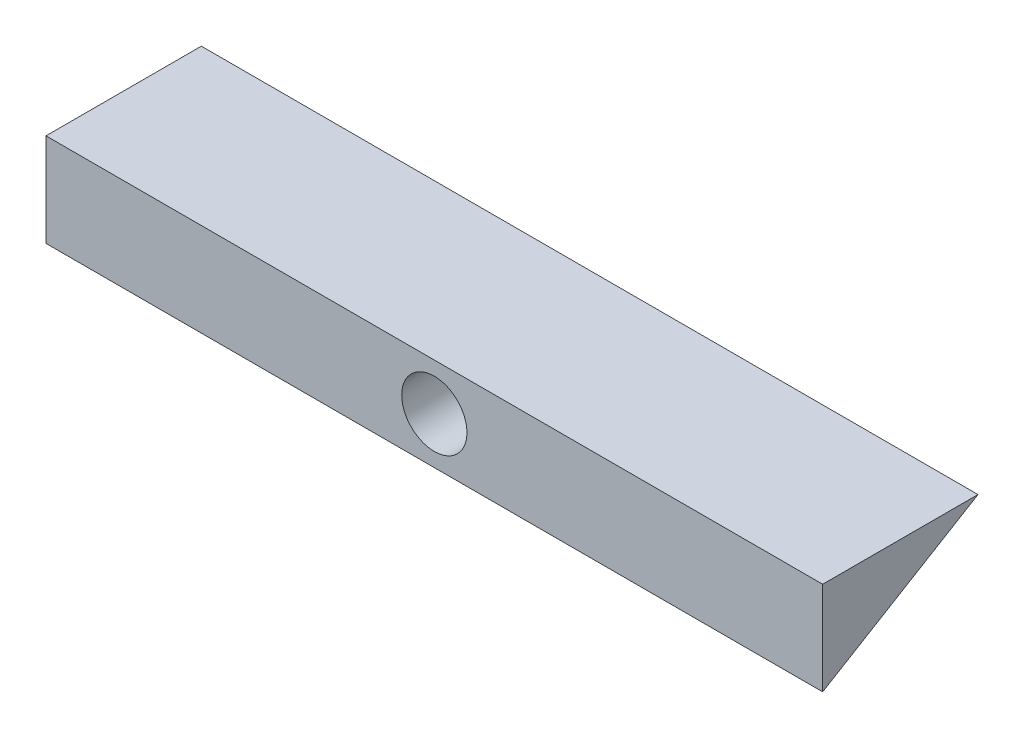
ISO-10303-21;
HEADER;
FILE_DESCRIPTION(('STEP AP214'),'2;1');
FILE_NAME('part.step','',(''),(''),'','','');
FILE_SCHEMA(('AUTOMOTIVE_DESIGN { 1 0 10303 214 1 1 1 1 }'));
ENDSEC;
DATA;
#1=APPLICATION_CONTEXT('core data for automotive mechanical design processes');
#2=APPLICATION_PROTOCOL_DEFINITION('international standard','automotive_design',2000,#1);
#3=PRODUCT_CONTEXT('',#1,'mechanical');
#4=PRODUCT('Part','Part','',(#3));
#5=PRODUCT_RELATED_PRODUCT_CATEGORY('part','',(#4));
#6=PRODUCT_DEFINITION_FORMATION('','',#4);
#7=PRODUCT_DEFINITION_CONTEXT('part definition',#1,'design');
#8=PRODUCT_DEFINITION('design','',#6,#7);
#9=PRODUCT_DEFINITION_SHAPE('','',#8);
#10=(LENGTH_UNIT() NAMED_UNIT(*) SI_UNIT(.MILLI.,.METRE.));
#11=(NAMED_UNIT(*) PLANE_ANGLE_UNIT() SI_UNIT($,.RADIAN.));
#12=(NAMED_UNIT(*) SI_UNIT($,.STERADIAN.) SOLID_ANGLE_UNIT());
#13=UNCERTAINTY_MEASURE_WITH_UNIT(LENGTH_MEASURE(1.E-05),#10,'distance_accuracy_value','');
#14=(GEOMETRIC_REPRESENTATION_CONTEXT(3) GLOBAL_UNCERTAINTY_ASSIGNED_CONTEXT((#13)) GLOBAL_UNIT_ASSIGNED_CONTEXT((#10,
#11,#12)) REPRESENTATION_CONTEXT('',''));
#15=CARTESIAN_POINT('',(0.,0.,0.));
#16=DIRECTION('',(0.,0.,1.));
#17=DIRECTION('',(1.,0.,0.));
#18=AXIS2_PLACEMENT_3D('',#15,#16,#17);
#19=CARTESIAN_POINT('',(25.,-3.,5.));
#20=DIRECTION('',(0.,0.857492925712544,0.514495755427527));
#21=DIRECTION('',(0.,-0.514495755427527,0.857492925712544));
#22=AXIS2_PLACEMENT_3D('',#19,#20,#21);
#23=PLANE('',#22);
#24=DIRECTION('',(-1.,0.,0.));
#25=VECTOR('',#24,1.);
#26=CARTESIAN_POINT('',(25.,0.,0.));
#27=LINE('',#26,#25);
#28=CARTESIAN_POINT('',(10.5,0.,0.));
#29=VERTEX_POINT('',#28);
#30=CARTESIAN_POINT('',(0.,0.,0.));
#31=VERTEX_POINT('',#30);
#32=EDGE_CURVE('E63',#29,#31,#27,.T.);
#33=ORIENTED_EDGE('',*,*,#32,.F.);
#34=DIRECTION('',(0.,-0.514495755427527,0.857492925712544));
#35=VECTOR('',#34,1.);
#36=CARTESIAN_POINT('',(10.5,-3.,5.));
#37=LINE('',#36,#35);
#38=CARTESIAN_POINT('',(10.5,-3.,5.));
#39=VERTEX_POINT('',#38);
#40=EDGE_CURVE('E134',#29,#39,#37,.T.);
#41=ORIENTED_EDGE('',*,*,#40,.T.);
#42=DIRECTION('',(-1.,0.,0.));
#43=VECTOR('',#42,1.);
#44=CARTESIAN_POINT('',(25.,-3.,5.));
#45=LINE('',#44,#43);
#46=CARTESIAN_POINT('',(0.,-3.,5.));
#47=VERTEX_POINT('',#46);
#48=EDGE_CURVE('E164',#39,#47,#45,.T.);
#49=ORIENTED_EDGE('',*,*,#48,.T.);
#50=DIRECTION('',(0.,0.514495755427527,-0.857492925712544));
#51=VECTOR('',#50,1.);
#52=CARTESIAN_POINT('',(0.,-3.,5.));
#53=LINE('',#52,#51);
#54=EDGE_CURVE('E152',#47,#31,#53,.T.);
#55=ORIENTED_EDGE('',*,*,#54,.T.);
#56=EDGE_LOOP('',(#33,#41,#49,#55));
#57=FACE_BOUND('',#56,.T.);
#58=ADVANCED_FACE('F53',(#57),#23,.F.);
#59=CARTESIAN_POINT('',(25.,-3.,5.));
#60=VERTEX_POINT('',#59);
#61=CARTESIAN_POINT('',(14.5,-3.,5.));
#62=VERTEX_POINT('',#61);
#63=EDGE_CURVE('E174',#60,#62,#45,.T.);
#64=ORIENTED_EDGE('',*,*,#63,.T.);
#65=DIRECTION('',(0.,0.514495755427527,-0.857492925712544));
#66=VECTOR('',#65,1.);
#67=CARTESIAN_POINT('',(14.5,-3.,5.));
#68=LINE('',#67,#66);
#69=CARTESIAN_POINT('',(14.5,0.,0.));
#70=VERTEX_POINT('',#69);
#71=EDGE_CURVE('E77',#62,#70,#68,.T.);
#72=ORIENTED_EDGE('',*,*,#71,.T.);
#73=CARTESIAN_POINT('',(25.,0.,0.));
#74=VERTEX_POINT('',#73);
#75=EDGE_CURVE('E11',#74,#70,#27,.T.);
#76=ORIENTED_EDGE('',*,*,#75,.F.);
#77=DIRECTION('',(0.,0.514495755427527,-0.857492925712544));
#78=VECTOR('',#77,1.);
#79=CARTESIAN_POINT('',(25.,-3.,5.));
#80=LINE('',#79,#78);
#81=EDGE_CURVE('E153',#60,#74,#80,.T.);
#82=ORIENTED_EDGE('',*,*,#81,.F.);
#83=EDGE_LOOP('',(#64,#72,#76,#82));
#84=FACE_BOUND('',#83,.T.);
#85=ADVANCED_FACE('F55',(#84),#23,.F.);
#86=CARTESIAN_POINT('',(25.,0.,0.));
#87=DIRECTION('',(0.,-1.,0.));
#88=DIRECTION('',(0.,0.,-1.));
#89=AXIS2_PLACEMENT_3D('',#86,#87,#88);
#90=PLANE('',#89);
#91=ORIENTED_EDGE('',*,*,#75,.T.);
#92=DIRECTION('',(-1.,0.,0.));
#93=VECTOR('',#92,1.);
#94=CARTESIAN_POINT('',(10.5,0.,0.));
#95=LINE('',#94,#93);
#96=EDGE_CURVE('E121',#70,#29,#95,.T.);
#97=ORIENTED_EDGE('',*,*,#96,.T.);
#98=ORIENTED_EDGE('',*,*,#32,.T.);
#99=DIRECTION('',(0.,0.,1.));
#100=VECTOR('',#99,1.);
#101=CARTESIAN_POINT('',(0.,0.,0.));
#102=LINE('',#101,#100);
#103=CARTESIAN_POINT('',(0.,0.,5.));
#104=VERTEX_POINT('',#103);
#105=EDGE_CURVE('E167',#31,#104,#102,.T.);
#106=ORIENTED_EDGE('',*,*,#105,.T.);
#107=DIRECTION('',(-1.,0.,0.));
#108=VECTOR('',#107,1.);
#109=CARTESIAN_POINT('',(25.,0.,5.));
#110=LINE('',#109,#108);
#111=CARTESIAN_POINT('',(25.,0.,5.));
#112=VERTEX_POINT('',#111);
#113=EDGE_CURVE('E177',#112,#104,#110,.T.);
#114=ORIENTED_EDGE('',*,*,#113,.F.);
#115=DIRECTION('',(0.,0.,1.));
#116=VECTOR('',#115,1.);
#117=CARTESIAN_POINT('',(25.,0.,0.));
#118=LINE('',#117,#116);
#119=EDGE_CURVE('E157',#74,#112,#118,.T.);
#120=ORIENTED_EDGE('',*,*,#119,.F.);
#121=EDGE_LOOP('',(#91,#97,#98,#106,#114,#120));
#122=FACE_BOUND('',#121,.T.);
#123=ADVANCED_FACE('F185',(#122),#90,.F.);
#124=CARTESIAN_POINT('',(25.,0.,5.));
#125=DIRECTION('',(0.,0.,-1.));
#126=DIRECTION('',(-1.,0.,0.));
#127=AXIS2_PLACEMENT_3D('',#124,#125,#126);
#128=PLANE('',#127);
#129=CARTESIAN_POINT('',(12.5,-1.5,5.));
#130=DIRECTION('',(0.,0.,-1.));
#131=DIRECTION('',(-1.,0.,0.));
#132=AXIS2_PLACEMENT_3D('',#129,#130,#131);
#133=CIRCLE('',#132,1.05);
#134=CARTESIAN_POINT('',(11.45,-1.5,5.));
#135=VERTEX_POINT('',#134);
#136=EDGE_CURVE('E140',#135,#135,#133,.T.);
#137=ORIENTED_EDGE('',*,*,#136,.T.);
#138=EDGE_LOOP('',(#137));
#139=FACE_BOUND('',#138,.T.);
#140=ORIENTED_EDGE('',*,*,#113,.T.);
#141=DIRECTION('',(0.,-1.,0.));
#142=VECTOR('',#141,1.);
#143=CARTESIAN_POINT('',(0.,0.,5.));
#144=LINE('',#143,#142);
#145=EDGE_CURVE('E158',#104,#47,#144,.T.);
#146=ORIENTED_EDGE('',*,*,#145,.T.);
#147=ORIENTED_EDGE('',*,*,#48,.F.);
#148=DIRECTION('',(1.,0.,0.));
#149=VECTOR('',#148,1.);
#150=CARTESIAN_POINT('',(10.5,-3.,5.));
#151=LINE('',#150,#149);
#152=EDGE_CURVE('E115',#39,#62,#151,.T.);
#153=ORIENTED_EDGE('',*,*,#152,.T.);
#154=ORIENTED_EDGE('',*,*,#63,.F.);
#155=DIRECTION('',(0.,-1.,0.));
#156=VECTOR('',#155,1.);
#157=CARTESIAN_POINT('',(25.,0.,5.));
#158=LINE('',#157,#156);
#159=EDGE_CURVE('E161',#112,#60,#158,.T.);
#160=ORIENTED_EDGE('',*,*,#159,.F.);
#161=EDGE_LOOP('',(#140,#146,#147,#153,#154,#160));
#162=FACE_BOUND('',#161,.T.);
#163=ADVANCED_FACE('F191',(#139,#162),#128,.F.);
#164=CARTESIAN_POINT('',(25.,0.,0.));
#165=DIRECTION('',(-1.,0.,0.));
#166=DIRECTION('',(0.,0.,1.));
#167=AXIS2_PLACEMENT_3D('',#164,#165,#166);
#168=PLANE('',#167);
#169=ORIENTED_EDGE('',*,*,#81,.T.);
#170=ORIENTED_EDGE('',*,*,#119,.T.);
#171=ORIENTED_EDGE('',*,*,#159,.T.);
#172=EDGE_LOOP('',(#169,#170,#171));
#173=FACE_BOUND('',#172,.T.);
#174=ADVANCED_FACE('F193',(#173),#168,.F.);
#175=CARTESIAN_POINT('',(0.,0.,0.));
#176=DIRECTION('',(-1.,0.,0.));
#177=DIRECTION('',(0.,0.,1.));
#178=AXIS2_PLACEMENT_3D('',#175,#176,#177);
#179=PLANE('',#178);
#180=ORIENTED_EDGE('',*,*,#54,.F.);
#181=ORIENTED_EDGE('',*,*,#145,.F.);
#182=ORIENTED_EDGE('',*,*,#105,.F.);
#183=EDGE_LOOP('',(#180,#181,#182));
#184=FACE_BOUND('',#183,.T.);
#185=ADVANCED_FACE('F189',(#184),#179,.T.);
#186=CARTESIAN_POINT('',(10.5,0.,0.));
#187=DIRECTION('',(-1.,0.,0.));
#188=DIRECTION('',(0.,0.,1.));
#189=AXIS2_PLACEMENT_3D('',#186,#187,#188);
#190=PLANE('',#189);
#191=ORIENTED_EDGE('',*,*,#40,.F.);
#192=DIRECTION('',(0.,-1.,0.));
#193=VECTOR('',#192,1.);
#194=CARTESIAN_POINT('',(10.5,0.,0.));
#195=LINE('',#194,#193);
#196=CARTESIAN_POINT('',(10.5,-3.,0.));
#197=VERTEX_POINT('',#196);
#198=EDGE_CURVE('E128',#29,#197,#195,.T.);
#199=ORIENTED_EDGE('',*,*,#198,.T.);
#200=DIRECTION('',(0.,0.,1.));
#201=VECTOR('',#200,1.);
#202=CARTESIAN_POINT('',(10.5,-3.,0.));
#203=LINE('',#202,#201);
#204=EDGE_CURVE('E110',#197,#39,#203,.T.);
#205=ORIENTED_EDGE('',*,*,#204,.T.);
#206=EDGE_LOOP('',(#191,#199,#205));
#207=FACE_BOUND('',#206,.T.);
#208=ADVANCED_FACE('F133',(#207),#190,.T.);
#209=CARTESIAN_POINT('',(14.5,0.,0.));
#210=DIRECTION('',(1.,0.,0.));
#211=DIRECTION('',(0.,0.,-1.));
#212=AXIS2_PLACEMENT_3D('',#209,#210,#211);
#213=PLANE('',#212);
#214=ORIENTED_EDGE('',*,*,#71,.F.);
#215=DIRECTION('',(0.,0.,1.));
#216=VECTOR('',#215,1.);
#217=CARTESIAN_POINT('',(14.5,-3.,0.));
#218=LINE('',#217,#216);
#219=CARTESIAN_POINT('',(14.5,-3.,0.));
#220=VERTEX_POINT('',#219);
#221=EDGE_CURVE('E120',#220,#62,#218,.T.);
#222=ORIENTED_EDGE('',*,*,#221,.F.);
#223=DIRECTION('',(0.,1.,0.));
#224=VECTOR('',#223,1.);
#225=CARTESIAN_POINT('',(14.5,0.,0.));
#226=LINE('',#225,#224);
#227=EDGE_CURVE('E130',#220,#70,#226,.T.);
#228=ORIENTED_EDGE('',*,*,#227,.T.);
#229=EDGE_LOOP('',(#214,#222,#228));
#230=FACE_BOUND('',#229,.T.);
#231=ADVANCED_FACE('F213',(#230),#213,.T.);
#232=CARTESIAN_POINT('',(10.5,-3.,0.));
#233=DIRECTION('',(0.,-1.,0.));
#234=DIRECTION('',(0.,0.,-1.));
#235=AXIS2_PLACEMENT_3D('',#232,#233,#234);
#236=PLANE('',#235);
#237=ORIENTED_EDGE('',*,*,#152,.F.);
#238=ORIENTED_EDGE('',*,*,#204,.F.);
#239=DIRECTION('',(1.,0.,0.));
#240=VECTOR('',#239,1.);
#241=CARTESIAN_POINT('',(10.5,-3.,0.));
#242=LINE('',#241,#240);
#243=EDGE_CURVE('E114',#197,#220,#242,.T.);
#244=ORIENTED_EDGE('',*,*,#243,.T.);
#245=ORIENTED_EDGE('',*,*,#221,.T.);
#246=EDGE_LOOP('',(#237,#238,#244,#245));
#247=FACE_BOUND('',#246,.T.);
#248=ADVANCED_FACE('F112',(#247),#236,.T.);
#249=CARTESIAN_POINT('',(0.,0.,0.));
#250=DIRECTION('',(0.,0.,1.));
#251=DIRECTION('',(1.,0.,0.));
#252=AXIS2_PLACEMENT_3D('',#249,#250,#251);
#253=PLANE('',#252);
#254=CARTESIAN_POINT('',(12.5,-1.5,0.));
#255=DIRECTION('',(0.,0.,1.));
#256=DIRECTION('',(1.,0.,0.));
#257=AXIS2_PLACEMENT_3D('',#254,#255,#256);
#258=CIRCLE('',#257,1.05);
#259=CARTESIAN_POINT('',(13.55,-1.5,0.));
#260=VERTEX_POINT('',#259);
#261=EDGE_CURVE('E57',#260,#260,#258,.T.);
#262=ORIENTED_EDGE('',*,*,#261,.T.);
#263=EDGE_LOOP('',(#262));
#264=FACE_BOUND('',#263,.T.);
#265=ORIENTED_EDGE('',*,*,#198,.F.);
#266=ORIENTED_EDGE('',*,*,#96,.F.);
#267=ORIENTED_EDGE('',*,*,#227,.F.);
#268=ORIENTED_EDGE('',*,*,#243,.F.);
#269=EDGE_LOOP('',(#265,#266,#267,#268));
#270=FACE_BOUND('',#269,.T.);
#271=ADVANCED_FACE('F126',(#264,#270),#253,.F.);
#272=CARTESIAN_POINT('',(12.5,-1.5,5.));
#273=DIRECTION('',(0.,0.,-1.));
#274=DIRECTION('',(-1.,0.,0.));
#275=AXIS2_PLACEMENT_3D('',#272,#273,#274);
#276=CYLINDRICAL_SURFACE('',#275,1.05);
#277=ORIENTED_EDGE('',*,*,#136,.F.);
#278=EDGE_LOOP('',(#277));
#279=FACE_BOUND('',#278,.T.);
#280=ORIENTED_EDGE('',*,*,#261,.F.);
#281=EDGE_LOOP('',(#280));
#282=FACE_BOUND('',#281,.T.);
#283=ADVANCED_FACE('F269',(#279,#282),#276,.F.);
#284=CLOSED_SHELL('',(#58,#85,#123,#163,#174,#185,#208,#231,#248,#271,#283));
#285=MANIFOLD_SOLID_BREP('B2',#284);
#286=ADVANCED_BREP_SHAPE_REPRESENTATION('',(#18,#285),#14);
#287=SHAPE_DEFINITION_REPRESENTATION(#9,#286);
ENDSEC;
END-ISO-10303-21;
